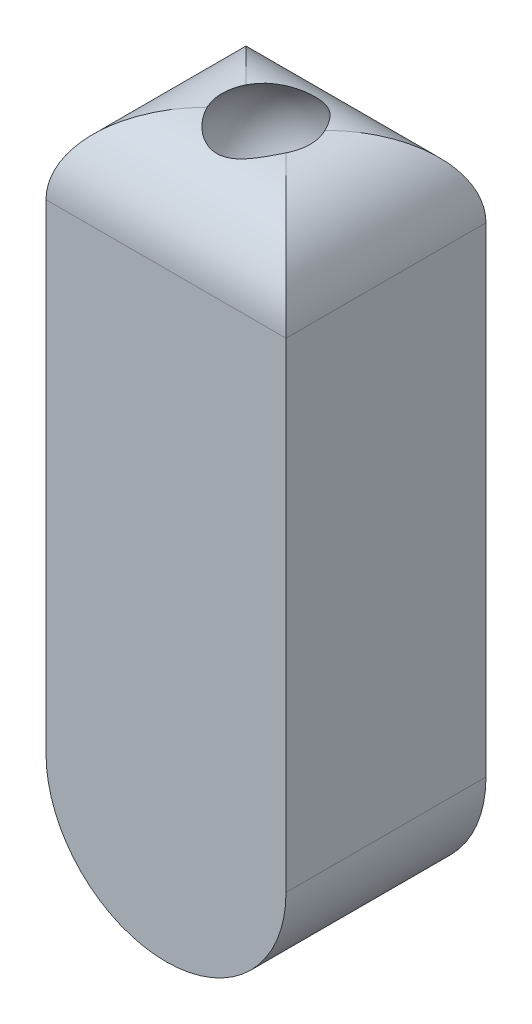
ISO-10303-21;
HEADER;
FILE_DESCRIPTION(('STEP AP214'),'2;1');
FILE_NAME('part.step','',(''),(''),'','','');
FILE_SCHEMA(('AUTOMOTIVE_DESIGN { 1 0 10303 214 1 1 1 1 }'));
ENDSEC;
DATA;
#1=APPLICATION_CONTEXT('core data for automotive mechanical design processes');
#2=APPLICATION_PROTOCOL_DEFINITION('international standard','automotive_design',2000,#1);
#3=PRODUCT_CONTEXT('',#1,'mechanical');
#4=PRODUCT('Part','Part','',(#3));
#5=PRODUCT_RELATED_PRODUCT_CATEGORY('part','',(#4));
#6=PRODUCT_DEFINITION_FORMATION('','',#4);
#7=PRODUCT_DEFINITION_CONTEXT('part definition',#1,'design');
#8=PRODUCT_DEFINITION('design','',#6,#7);
#9=PRODUCT_DEFINITION_SHAPE('','',#8);
#10=(LENGTH_UNIT() NAMED_UNIT(*) SI_UNIT(.MILLI.,.METRE.));
#11=(NAMED_UNIT(*) PLANE_ANGLE_UNIT() SI_UNIT($,.RADIAN.));
#12=(NAMED_UNIT(*) SI_UNIT($,.STERADIAN.) SOLID_ANGLE_UNIT());
#13=UNCERTAINTY_MEASURE_WITH_UNIT(LENGTH_MEASURE(1.E-05),#10,'distance_accuracy_value','');
#14=(GEOMETRIC_REPRESENTATION_CONTEXT(3) GLOBAL_UNCERTAINTY_ASSIGNED_CONTEXT((#13)) GLOBAL_UNIT_ASSIGNED_CONTEXT((#10,
#11,#12)) REPRESENTATION_CONTEXT('',''));
#15=CARTESIAN_POINT('',(0.,0.,0.));
#16=DIRECTION('',(0.,0.,1.));
#17=DIRECTION('',(1.,0.,0.));
#18=AXIS2_PLACEMENT_3D('',#15,#16,#17);
#19=CARTESIAN_POINT('',(-38.1,88.9,63.5));
#20=DIRECTION('',(0.,-1.,0.));
#21=DIRECTION('',(0.,0.,-1.));
#22=AXIS2_PLACEMENT_3D('',#19,#20,#21);
#23=PLANE('',#22);
#24=CARTESIAN_POINT('',(0.,88.9,31.75));
#25=DIRECTION('',(0.,-1.,0.));
#26=DIRECTION('',(0.,0.,-1.));
#27=AXIS2_PLACEMENT_3D('',#24,#25,#26);
#28=CIRCLE('',#27,13.97);
#29=CARTESIAN_POINT('',(-12.4434078933385,88.9,25.4));
#30=VERTEX_POINT('',#29);
#31=CARTESIAN_POINT('',(-12.7,88.9,25.9301288674061));
#32=VERTEX_POINT('',#31);
#33=EDGE_CURVE('E140',#30,#32,#28,.F.);
#34=ORIENTED_EDGE('',*,*,#33,.F.);
#35=DIRECTION('',(-1.,0.,0.));
#36=VECTOR('',#35,1.);
#37=CARTESIAN_POINT('',(-38.1,88.9,25.4));
#38=LINE('',#37,#36);
#39=CARTESIAN_POINT('',(-12.7,88.9,25.4));
#40=VERTEX_POINT('',#39);
#41=EDGE_CURVE('E199',#30,#40,#38,.T.);
#42=ORIENTED_EDGE('',*,*,#41,.T.);
#43=DIRECTION('',(0.,0.,-1.));
#44=VECTOR('',#43,1.);
#45=CARTESIAN_POINT('',(-12.7,88.9,63.5));
#46=LINE('',#45,#44);
#47=EDGE_CURVE('E141',#40,#32,#46,.F.);
#48=ORIENTED_EDGE('',*,*,#47,.T.);
#49=EDGE_LOOP('',(#34,#42,#48));
#50=FACE_BOUND('',#49,.T.);
#51=ADVANCED_FACE('F39',(#50),#23,.F.);
#52=CARTESIAN_POINT('',(-12.7,88.9,37.5698711325939));
#53=VERTEX_POINT('',#52);
#54=CARTESIAN_POINT('',(-12.4434078933369,88.9,38.1));
#55=VERTEX_POINT('',#54);
#56=EDGE_CURVE('E63',#53,#55,#28,.F.);
#57=ORIENTED_EDGE('',*,*,#56,.F.);
#58=CARTESIAN_POINT('',(-12.7,88.9,38.1));
#59=VERTEX_POINT('',#58);
#60=EDGE_CURVE('E150',#53,#59,#46,.F.);
#61=ORIENTED_EDGE('',*,*,#60,.T.);
#62=DIRECTION('',(-1.,0.,0.));
#63=VECTOR('',#62,1.);
#64=CARTESIAN_POINT('',(38.1,88.9,38.1));
#65=LINE('',#64,#63);
#66=EDGE_CURVE('E142',#59,#55,#65,.F.);
#67=ORIENTED_EDGE('',*,*,#66,.T.);
#68=EDGE_LOOP('',(#57,#61,#67));
#69=FACE_BOUND('',#68,.T.);
#70=ADVANCED_FACE('F272',(#69),#23,.F.);
#71=CARTESIAN_POINT('',(12.4434078933386,88.9,38.1));
#72=VERTEX_POINT('',#71);
#73=CARTESIAN_POINT('',(12.7,88.9,37.5698711325939));
#74=VERTEX_POINT('',#73);
#75=EDGE_CURVE('E121',#72,#74,#28,.F.);
#76=ORIENTED_EDGE('',*,*,#75,.F.);
#77=CARTESIAN_POINT('',(12.7,88.9,38.1));
#78=VERTEX_POINT('',#77);
#79=EDGE_CURVE('E134',#72,#78,#65,.F.);
#80=ORIENTED_EDGE('',*,*,#79,.T.);
#81=DIRECTION('',(0.,0.,-1.));
#82=VECTOR('',#81,1.);
#83=CARTESIAN_POINT('',(12.7,88.9,63.5));
#84=LINE('',#83,#82);
#85=EDGE_CURVE('E131',#78,#74,#84,.T.);
#86=ORIENTED_EDGE('',*,*,#85,.T.);
#87=EDGE_LOOP('',(#76,#80,#86));
#88=FACE_BOUND('',#87,.T.);
#89=ADVANCED_FACE('F133',(#88),#23,.F.);
#90=CARTESIAN_POINT('',(-38.1,63.5,25.4));
#91=DIRECTION('',(-1.,0.,0.));
#92=DIRECTION('',(0.,0.,1.));
#93=AXIS2_PLACEMENT_3D('',#90,#91,#92);
#94=CYLINDRICAL_SURFACE('',#93,25.4);
#95=ORIENTED_EDGE('',*,*,#41,.F.);
#96=CARTESIAN_POINT('',(-12.4435099543191,88.8999999992126,25.4002));
#97=CARTESIAN_POINT('',(-12.3323761394084,88.9000042449535,25.1824251378869));
#98=CARTESIAN_POINT('',(-12.2181755256439,88.8972019137025,24.9662394006213));
#99=CARTESIAN_POINT('',(-11.9835210184639,88.8862549511401,24.5374161790704));
#100=CARTESIAN_POINT('',(-11.8630668911387,88.8781101198622,24.3247788279045));
#101=CARTESIAN_POINT('',(-11.4920219513742,88.8460568058496,23.6925376958124));
#102=CARTESIAN_POINT('',(-11.231870188645,88.8145300895076,23.2788444702196));
#103=CARTESIAN_POINT('',(-10.6829315067911,88.7334616700738,22.4673902927873));
#104=CARTESIAN_POINT('',(-10.3939108203554,88.6837624790236,22.0698034422654));
#105=CARTESIAN_POINT('',(-9.78828505842701,88.5697033852126,21.2985635800477));
#106=CARTESIAN_POINT('',(-9.47168952404195,88.5053485410728,20.9249023669369));
#107=CARTESIAN_POINT('',(-8.86453774695291,88.3774638120554,20.2652775370036));
#108=CARTESIAN_POINT('',(-8.5783045187031,88.3155499174555,19.9750168269296));
#109=CARTESIAN_POINT('',(-7.98538168086478,88.186998174893,19.4171905574059));
#110=CARTESIAN_POINT('',(-7.6786909909998,88.1203600774524,19.1496261981569));
#111=CARTESIAN_POINT('',(-7.04572651488522,87.9857358932849,18.6414791832718));
#112=CARTESIAN_POINT('',(-6.71952458571322,87.9177553040537,18.4008058788415));
#113=CARTESIAN_POINT('',(-6.04677524519961,87.783754191526,17.9491777594111));
#114=CARTESIAN_POINT('',(-5.70023452347447,87.7177330343927,17.7382132496643));
#115=CARTESIAN_POINT('',(-5.07765079044909,87.6074512958687,17.3991183865022));
#116=CARTESIAN_POINT('',(-4.80589130757054,87.5619043296917,17.2635204621122));
#117=CARTESIAN_POINT('',(-4.25224896104928,87.4757529394808,17.0130572499707));
#118=CARTESIAN_POINT('',(-3.97036871946732,87.4351472470705,16.8981866380507));
#119=CARTESIAN_POINT('',(-3.39759967527705,87.3605309246433,16.6909694517745));
#120=CARTESIAN_POINT('',(-3.1067119558058,87.3265195052181,16.5986201810196));
#121=CARTESIAN_POINT('',(-2.51762878717357,87.2666255399975,16.4381440568044));
#122=CARTESIAN_POINT('',(-2.21943702312728,87.240738982459,16.3700052469513));
#123=CARTESIAN_POINT('',(-1.61551424701501,87.1981776248218,16.2588860466694));
#124=CARTESIAN_POINT('',(-1.30974465504036,87.1815697745577,16.2160883743126));
#125=CARTESIAN_POINT('',(-0.69523501454927,87.1587188586113,16.157379880083));
#126=CARTESIAN_POINT('',(-0.386494986934548,87.1524757200503,16.141468869159));
#127=CARTESIAN_POINT('',(0.231193115461653,87.1506902273434,16.136908865138));
#128=CARTESIAN_POINT('',(0.54014117269709,87.1551470620231,16.1482578054407));
#129=CARTESIAN_POINT('',(1.15550883645203,87.1745203594344,16.1979463292706));
#130=CARTESIAN_POINT('',(1.46192854776175,87.1894363864471,16.2362847884433));
#131=CARTESIAN_POINT('',(2.03924107288622,87.2269586480264,16.3339176068908));
#132=CARTESIAN_POINT('',(2.31061956563735,87.2486455369375,16.3907298683186));
#133=CARTESIAN_POINT('',(2.8477831856613,87.2989773181044,16.5245403082183));
#134=CARTESIAN_POINT('',(3.11356623136959,87.3276247517352,16.6015458603086));
#135=CARTESIAN_POINT('',(3.63802660082103,87.3907780332003,16.7745040803398));
#136=CARTESIAN_POINT('',(3.89670688520434,87.4252813956828,16.8704487130307));
#137=CARTESIAN_POINT('',(4.40614708155393,87.4989573825342,17.080001217652));
#138=CARTESIAN_POINT('',(4.65690520521922,87.5381310517571,17.1936130438729));
#139=CARTESIAN_POINT('',(5.25392095255965,87.637174329067,17.4886057709184));
#140=CARTESIAN_POINT('',(5.59578010904683,87.6987968130262,17.6783422948222));
#141=CARTESIAN_POINT('',(6.26090882874679,87.8254236376158,18.0870300192));
#142=CARTESIAN_POINT('',(6.58417161429493,87.8904291950114,18.3059917758228));
#143=CARTESIAN_POINT('',(7.21308784615848,88.0208066497886,18.770633673539));
#144=CARTESIAN_POINT('',(7.51865437064268,88.0861788670656,19.0164309789337));
#145=CARTESIAN_POINT('',(8.11061586038351,88.213992366933,19.5306870622638));
#146=CARTESIAN_POINT('',(8.39701123517445,88.2764337121242,19.7991453558379));
#147=CARTESIAN_POINT('',(9.05831568393889,88.4188505653076,20.4637421746673));
#148=CARTESIAN_POINT('',(9.42456582364446,88.4962552553609,20.869073832053));
#149=CARTESIAN_POINT('',(10.1223957760561,88.6343947412316,21.7115629908707));
#150=CARTESIAN_POINT('',(10.4539523285887,88.6951183970916,22.1487415150086));
#151=CARTESIAN_POINT('',(10.9243481533836,88.7697634810403,22.8213604227722));
#152=CARTESIAN_POINT('',(11.0759246828504,88.7918309411275,23.0471369159092));
#153=CARTESIAN_POINT('',(11.3710262125091,88.830205094454,23.5043965829794));
#154=CARTESIAN_POINT('',(11.5145510655745,88.8465116824549,23.7358798610802));
#155=CARTESIAN_POINT('',(11.7935004093556,88.8728882836279,24.2036189243471));
#156=CARTESIAN_POINT('',(11.9289348975325,88.8829661440994,24.4398683155934));
#157=CARTESIAN_POINT('',(12.1920228909456,88.8965265481862,24.9168292547207));
#158=CARTESIAN_POINT('',(12.3196768458115,88.9000094732671,25.1575405437024));
#159=CARTESIAN_POINT('',(12.4435099543192,88.8999999992127,25.4001999999999));
#160=B_SPLINE_CURVE_WITH_KNOTS('',3,(#96,#97,#98,#99,#100,#101,#102,#103,#104,#105,#106,#107,
#108,#109,#110,#111,#112,#113,#114,#115,#116,#117,#118,#119,#120,#121,#122,#123,#124,#125,#126,
#127,#128,#129,#130,#131,#132,#133,#134,#135,#136,#137,#138,#139,#140,#141,#142,#143,#144,#145,
#146,#147,#148,#149,#150,#151,#152,#153,#154,#155,#156,#157,#158,#159),.UNSPECIFIED.,.F.,.F.,(4,
2,2,2,2,2,2,2,2,2,2,2,2,2,2,2,2,2,2,2,2,2,2,2,2,2,2,2,2,2,2,4),(0.,0.733392977951157,
1.46681340791192,2.93445847423132,4.41513630411131,5.89530382812477,7.13124023551552,
8.36724195949599,9.5989427528822,10.8302406744648,11.7507529821406,12.6710285026762,
13.5911937878036,14.5109040134576,15.4371673583551,16.3634241902843,17.2896108041016,
18.215758836258,19.0491910239121,19.8829279657094,20.7163119367581,21.5498827059056,
22.7355304823032,23.9216076792931,25.1130877018125,26.3045422637953,27.9572738878498,
29.6111065735348,30.4294076988603,31.2477237719496,32.0650067718591,32.8822424968748),.UNSPECIFIED.);
#161=CARTESIAN_POINT('',(12.4434078933385,88.9,25.4));
#162=VERTEX_POINT('',#161);
#163=EDGE_CURVE('E156',#30,#162,#160,.T.);
#164=ORIENTED_EDGE('',*,*,#163,.T.);
#165=CARTESIAN_POINT('',(12.7,88.9,25.4));
#166=VERTEX_POINT('',#165);
#167=EDGE_CURVE('E203',#166,#162,#38,.T.);
#168=ORIENTED_EDGE('',*,*,#167,.F.);
#169=CARTESIAN_POINT('',(12.7,63.5,25.4));
#170=DIRECTION('',(-0.707106781186547,0.,-0.707106781186547));
#171=DIRECTION('',(0.707106781186547,0.,-0.707106781186547));
#172=AXIS2_PLACEMENT_3D('',#169,#170,#171);
#173=ELLIPSE('',#172,35.9210244842766,25.4);
#174=CARTESIAN_POINT('',(38.1,63.5,0.));
#175=VERTEX_POINT('',#174);
#176=EDGE_CURVE('E159',#175,#166,#173,.F.);
#177=ORIENTED_EDGE('',*,*,#176,.F.);
#178=DIRECTION('',(-1.,0.,0.));
#179=VECTOR('',#178,1.);
#180=CARTESIAN_POINT('',(0.,63.5,0.));
#181=LINE('',#180,#179);
#182=CARTESIAN_POINT('',(-38.1,63.5,0.));
#183=VERTEX_POINT('',#182);
#184=EDGE_CURVE('E66',#183,#175,#181,.F.);
#185=ORIENTED_EDGE('',*,*,#184,.F.);
#186=CARTESIAN_POINT('',(-12.7,63.5,25.4));
#187=DIRECTION('',(-0.707106781186547,0.,0.707106781186547));
#188=DIRECTION('',(-0.707106781186547,0.,-0.707106781186547));
#189=AXIS2_PLACEMENT_3D('',#186,#187,#188);
#190=ELLIPSE('',#189,35.9210244842766,25.4);
#191=EDGE_CURVE('E158',#40,#183,#190,.T.);
#192=ORIENTED_EDGE('',*,*,#191,.F.);
#193=EDGE_LOOP('',(#95,#164,#168,#177,#185,#192));
#194=FACE_BOUND('',#193,.T.);
#195=ADVANCED_FACE('F41',(#194),#94,.T.);
#196=CARTESIAN_POINT('',(12.7,63.5,63.5));
#197=DIRECTION('',(0.,0.,-1.));
#198=DIRECTION('',(-1.,0.,0.));
#199=AXIS2_PLACEMENT_3D('',#196,#197,#198);
#200=CYLINDRICAL_SURFACE('',#199,25.4);
#201=CARTESIAN_POINT('',(12.7,88.9,25.930128867406));
#202=VERTEX_POINT('',#201);
#203=EDGE_CURVE('E200',#202,#166,#84,.T.);
#204=ORIENTED_EDGE('',*,*,#203,.F.);
#205=CARTESIAN_POINT('',(12.6998,88.8999999992126,25.9296924494286));
#206=CARTESIAN_POINT('',(12.8633109394039,88.8999722694415,26.2862973326325));
#207=CARTESIAN_POINT('',(13.013232462508,88.8984204295879,26.6492593260507));
#208=CARTESIAN_POINT('',(13.283784276495,88.893659282895,27.3861785212475));
#209=CARTESIAN_POINT('',(13.4043955509052,88.8904489041957,27.7601426858032));
#210=CARTESIAN_POINT('',(13.6138370922187,88.8837701775928,28.5163027772611));
#211=CARTESIAN_POINT('',(13.7027156156466,88.8803022311634,28.8984852598445));
#212=CARTESIAN_POINT('',(13.8472100818346,88.8741834766966,29.6690133232489));
#213=CARTESIAN_POINT('',(13.9028346890403,88.8715324558932,30.0573572715801));
#214=CARTESIAN_POINT('',(13.9798629804661,88.8677640744831,30.8391707328676));
#215=CARTESIAN_POINT('',(14.001115569141,88.8666534884812,31.2326552526361));
#216=CARTESIAN_POINT('',(14.0084676042009,88.8662754204029,32.0200112028377));
#217=CARTESIAN_POINT('',(13.9945618292534,88.8670082120845,32.4138826820546));
#218=CARTESIAN_POINT('',(13.9319117930881,88.8701274092166,33.1985195116685));
#219=CARTESIAN_POINT('',(13.883194914104,88.8725125149204,33.5892870594794));
#220=CARTESIAN_POINT('',(13.7520172536461,88.8782887266134,34.3649411126915));
#221=CARTESIAN_POINT('',(13.6695663403722,88.8816795383243,34.7498293038507));
#222=CARTESIAN_POINT('',(13.4626468265231,88.888779744354,35.54950093231));
#223=CARTESIAN_POINT('',(13.3347954916458,88.8924870114904,35.9634148901514));
#224=CARTESIAN_POINT('',(13.1161401618788,88.8966944518203,36.5741097399749));
#225=CARTESIAN_POINT('',(13.0388396821803,88.8978709992306,36.7758391510879));
#226=CARTESIAN_POINT('',(12.8756604024558,88.899523517354,37.1757667226575));
#227=CARTESIAN_POINT('',(12.789782925573,88.8999995959484,37.3739654222428));
#228=CARTESIAN_POINT('',(12.6998,88.8999999992126,37.5703075505714));
#229=B_SPLINE_CURVE_WITH_KNOTS('',3,(#205,#206,#207,#208,#209,#210,#211,#212,#213,#214,#215,
#216,#217,#218,#219,#220,#221,#222,#223,#224,#225,#226,#227,#228),.UNSPECIFIED.,.F.,.F.,(4,2,2,
2,2,2,2,2,2,2,2,4),(0.,1.1767998607244,2.35436120223384,3.53012410172385,4.70558051765664,
5.8861902003584,7.066975224489,8.24683247023635,9.42634481943627,10.7240615407519,
11.3720011443585,12.0198409465534),.UNSPECIFIED.);
#230=EDGE_CURVE('E219',#202,#74,#229,.T.);
#231=ORIENTED_EDGE('',*,*,#230,.T.);
#232=ORIENTED_EDGE('',*,*,#85,.F.);
#233=CARTESIAN_POINT('',(12.7,63.5,38.1));
#234=DIRECTION('',(0.707106781186547,0.,-0.707106781186547));
#235=DIRECTION('',(-0.707106781186547,0.,-0.707106781186547));
#236=AXIS2_PLACEMENT_3D('',#233,#234,#235);
#237=ELLIPSE('',#236,35.9210244842766,25.4);
#238=CARTESIAN_POINT('',(38.1,63.5,63.5));
#239=VERTEX_POINT('',#238);
#240=EDGE_CURVE('E143',#239,#78,#237,.F.);
#241=ORIENTED_EDGE('',*,*,#240,.F.);
#242=DIRECTION('',(0.,0.,-1.));
#243=VECTOR('',#242,1.);
#244=CARTESIAN_POINT('',(38.1,63.5,63.5));
#245=LINE('',#244,#243);
#246=EDGE_CURVE('E53',#175,#239,#245,.F.);
#247=ORIENTED_EDGE('',*,*,#246,.F.);
#248=ORIENTED_EDGE('',*,*,#176,.T.);
#249=EDGE_LOOP('',(#204,#231,#232,#241,#247,#248));
#250=FACE_BOUND('',#249,.T.);
#251=ADVANCED_FACE('F250',(#250),#200,.T.);
#252=CARTESIAN_POINT('',(-12.7,63.5,63.5));
#253=DIRECTION('',(0.,0.,-1.));
#254=DIRECTION('',(-1.,0.,0.));
#255=AXIS2_PLACEMENT_3D('',#252,#253,#254);
#256=CYLINDRICAL_SURFACE('',#255,25.4);
#257=ORIENTED_EDGE('',*,*,#60,.F.);
#258=CARTESIAN_POINT('',(-12.6998,88.8999999992126,37.5703075505713));
#259=CARTESIAN_POINT('',(-12.8633109394039,88.8999722694415,37.2137026673674));
#260=CARTESIAN_POINT('',(-13.013232462508,88.8984204295879,36.8507406739492));
#261=CARTESIAN_POINT('',(-13.283784276495,88.893659282895,36.1138214787524));
#262=CARTESIAN_POINT('',(-13.4043955509053,88.8904489041957,35.7398573141968));
#263=CARTESIAN_POINT('',(-13.6138370922188,88.8837701775928,34.9836972227388));
#264=CARTESIAN_POINT('',(-13.7027156156466,88.8803022311634,34.6015147401555));
#265=CARTESIAN_POINT('',(-13.8472100818346,88.8741834766966,33.830986676751));
#266=CARTESIAN_POINT('',(-13.9028346890403,88.8715324558932,33.4426427284198));
#267=CARTESIAN_POINT('',(-13.9798629804661,88.8677640744831,32.6608292671323));
#268=CARTESIAN_POINT('',(-14.001115569141,88.8666534884812,32.2673447473638));
#269=CARTESIAN_POINT('',(-14.0084676042009,88.8662754204029,31.4799887971622));
#270=CARTESIAN_POINT('',(-13.9945618292534,88.8670082120845,31.0861173179453));
#271=CARTESIAN_POINT('',(-13.9319117930881,88.8701274092166,30.3014804883314));
#272=CARTESIAN_POINT('',(-13.883194914104,88.8725125149204,29.9107129405205));
#273=CARTESIAN_POINT('',(-13.7520172536461,88.8782887266134,29.1350588873085));
#274=CARTESIAN_POINT('',(-13.6695663403722,88.8816795383243,28.7501706961492));
#275=CARTESIAN_POINT('',(-13.462646826523,88.888779744354,27.9504990676899));
#276=CARTESIAN_POINT('',(-13.3347954916458,88.8924870114904,27.5365851098486));
#277=CARTESIAN_POINT('',(-13.1161401618788,88.8966944518203,26.9258902600251));
#278=CARTESIAN_POINT('',(-13.0388396821803,88.8978709992306,26.7241608489121));
#279=CARTESIAN_POINT('',(-12.8756604024559,88.899523517354,26.3242332773425));
#280=CARTESIAN_POINT('',(-12.789782925573,88.8999995959484,26.1260345777573));
#281=CARTESIAN_POINT('',(-12.6998,88.8999999992126,25.9296924494287));
#282=B_SPLINE_CURVE_WITH_KNOTS('',3,(#258,#259,#260,#261,#262,#263,#264,#265,#266,#267,#268,
#269,#270,#271,#272,#273,#274,#275,#276,#277,#278,#279,#280,#281),.UNSPECIFIED.,.F.,.F.,(4,2,2,
2,2,2,2,2,2,2,2,4),(0.,1.1767998607244,2.35436120223384,3.53012410172386,4.70558051765665,
5.88619020035841,7.06697522448901,8.24683247023636,9.42634481943628,10.7240615407518,
11.3720011443584,12.0198409465533),.UNSPECIFIED.);
#283=EDGE_CURVE('E217',#53,#32,#282,.T.);
#284=ORIENTED_EDGE('',*,*,#283,.T.);
#285=ORIENTED_EDGE('',*,*,#47,.F.);
#286=ORIENTED_EDGE('',*,*,#191,.T.);
#287=DIRECTION('',(0.,0.,-1.));
#288=VECTOR('',#287,1.);
#289=CARTESIAN_POINT('',(-38.1,63.5,63.5));
#290=LINE('',#289,#288);
#291=CARTESIAN_POINT('',(-38.1,63.5,63.5));
#292=VERTEX_POINT('',#291);
#293=EDGE_CURVE('E144',#292,#183,#290,.T.);
#294=ORIENTED_EDGE('',*,*,#293,.F.);
#295=CARTESIAN_POINT('',(-12.7,63.5,38.1));
#296=DIRECTION('',(-0.707106781186547,0.,-0.707106781186547));
#297=DIRECTION('',(0.707106781186547,0.,-0.707106781186547));
#298=AXIS2_PLACEMENT_3D('',#295,#296,#297);
#299=ELLIPSE('',#298,35.9210244842766,25.4);
#300=EDGE_CURVE('E152',#59,#292,#299,.F.);
#301=ORIENTED_EDGE('',*,*,#300,.F.);
#302=EDGE_LOOP('',(#257,#284,#285,#286,#294,#301));
#303=FACE_BOUND('',#302,.T.);
#304=ADVANCED_FACE('F220',(#303),#256,.T.);
#305=CARTESIAN_POINT('',(0.,63.5,38.1));
#306=DIRECTION('',(1.,0.,0.));
#307=DIRECTION('',(0.,0.,-1.));
#308=AXIS2_PLACEMENT_3D('',#305,#306,#307);
#309=CYLINDRICAL_SURFACE('',#308,25.4);
#310=ORIENTED_EDGE('',*,*,#79,.F.);
#311=CARTESIAN_POINT('',(12.4435099543191,88.8999999992126,38.0998));
#312=CARTESIAN_POINT('',(12.3323761394084,88.9000042449535,38.3175748621131));
#313=CARTESIAN_POINT('',(12.2181755256439,88.8972019137025,38.5337605993787));
#314=CARTESIAN_POINT('',(11.9835210184639,88.8862549511401,38.9625838209296));
#315=CARTESIAN_POINT('',(11.8630668911387,88.8781101198622,39.1752211720955));
#316=CARTESIAN_POINT('',(11.4920219513742,88.8460568058496,39.8074623041876));
#317=CARTESIAN_POINT('',(11.231870188645,88.8145300895076,40.2211555297804));
#318=CARTESIAN_POINT('',(10.6829315067911,88.7334616700738,41.0326097072127));
#319=CARTESIAN_POINT('',(10.3939108203554,88.6837624790236,41.4301965577346));
#320=CARTESIAN_POINT('',(9.78828505842701,88.5697033852126,42.2014364199523));
#321=CARTESIAN_POINT('',(9.47168952404195,88.5053485410728,42.5750976330631));
#322=CARTESIAN_POINT('',(8.86453774695291,88.3774638120554,43.2347224629964));
#323=CARTESIAN_POINT('',(8.57830451870309,88.3155499174555,43.5249831730704));
#324=CARTESIAN_POINT('',(7.98538168086477,88.186998174893,44.0828094425941));
#325=CARTESIAN_POINT('',(7.67869099099979,88.1203600774524,44.3503738018431));
#326=CARTESIAN_POINT('',(7.04572651488522,87.9857358932848,44.8585208167282));
#327=CARTESIAN_POINT('',(6.71952458571321,87.9177553040537,45.0991941211585));
#328=CARTESIAN_POINT('',(6.0467752451996,87.783754191526,45.5508222405889));
#329=CARTESIAN_POINT('',(5.70023452347446,87.7177330343928,45.7617867503357));
#330=CARTESIAN_POINT('',(5.07765079044909,87.6074512958687,46.1008816134978));
#331=CARTESIAN_POINT('',(4.80589130757054,87.5619043296916,46.2364795378878));
#332=CARTESIAN_POINT('',(4.25224896104929,87.4757529394807,46.4869427500293));
#333=CARTESIAN_POINT('',(3.97036871946733,87.4351472470705,46.6018133619493));
#334=CARTESIAN_POINT('',(3.39759967527706,87.3605309246433,46.8090305482255));
#335=CARTESIAN_POINT('',(3.1067119558058,87.3265195052181,46.9013798189804));
#336=CARTESIAN_POINT('',(2.51762878717357,87.2666255399975,47.0618559431956));
#337=CARTESIAN_POINT('',(2.21943702312728,87.240738982459,47.1299947530487));
#338=CARTESIAN_POINT('',(1.61551424701501,87.1981776248218,47.2411139533306));
#339=CARTESIAN_POINT('',(1.30974465504036,87.1815697745577,47.2839116256874));
#340=CARTESIAN_POINT('',(0.695235014549272,87.1587188586113,47.342620119917));
#341=CARTESIAN_POINT('',(0.386494986934552,87.1524757200503,47.358531130841));
#342=CARTESIAN_POINT('',(-0.231193115461649,87.1506902273434,47.363091134862));
#343=CARTESIAN_POINT('',(-0.540141172697086,87.1551470620231,47.3517421945593));
#344=CARTESIAN_POINT('',(-1.15550883645203,87.1745203594344,47.3020536707294));
#345=CARTESIAN_POINT('',(-1.46192854776174,87.1894363864471,47.2637152115567));
#346=CARTESIAN_POINT('',(-2.03924107288622,87.2269586480264,47.1660823931092));
#347=CARTESIAN_POINT('',(-2.31061956563734,87.2486455369375,47.1092701316814));
#348=CARTESIAN_POINT('',(-2.84778318566129,87.2989773181044,46.9754596917817));
#349=CARTESIAN_POINT('',(-3.11356623136958,87.3276247517352,46.8984541396914));
#350=CARTESIAN_POINT('',(-3.63802660082103,87.3907780332003,46.7254959196602));
#351=CARTESIAN_POINT('',(-3.89670688520434,87.4252813956828,46.6295512869693));
#352=CARTESIAN_POINT('',(-4.40614708155392,87.4989573825342,46.419998782348));
#353=CARTESIAN_POINT('',(-4.65690520521921,87.5381310517571,46.3063869561271));
#354=CARTESIAN_POINT('',(-5.25392095255964,87.637174329067,46.0113942290816));
#355=CARTESIAN_POINT('',(-5.59578010904683,87.6987968130262,45.8216577051778));
#356=CARTESIAN_POINT('',(-6.26090882874678,87.8254236376158,45.4129699808));
#357=CARTESIAN_POINT('',(-6.58417161429492,87.8904291950114,45.1940082241772));
#358=CARTESIAN_POINT('',(-7.21308784615848,88.0208066497886,44.729366326461));
#359=CARTESIAN_POINT('',(-7.51865437064268,88.0861788670656,44.4835690210663));
#360=CARTESIAN_POINT('',(-8.11061586038351,88.213992366933,43.9693129377362));
#361=CARTESIAN_POINT('',(-8.39701123517445,88.2764337121242,43.7008546441621));
#362=CARTESIAN_POINT('',(-9.05831568393888,88.4188505653076,43.0362578253326));
#363=CARTESIAN_POINT('',(-9.42456582364445,88.4962552553609,42.630926167947));
#364=CARTESIAN_POINT('',(-10.1223957760561,88.6343947412316,41.7884370091293));
#365=CARTESIAN_POINT('',(-10.4539523285887,88.6951183970916,41.3512584849914));
#366=CARTESIAN_POINT('',(-10.9243481533836,88.7697634810403,40.6786395772278));
#367=CARTESIAN_POINT('',(-11.0759246828504,88.7918309411275,40.4528630840908));
#368=CARTESIAN_POINT('',(-11.3710262125091,88.830205094454,39.9956034170206));
#369=CARTESIAN_POINT('',(-11.5145510655745,88.8465116824549,39.7641201389198));
#370=CARTESIAN_POINT('',(-11.7935004093556,88.8728882836279,39.2963810756529));
#371=CARTESIAN_POINT('',(-11.9289348975325,88.8829661440994,39.0601316844066));
#372=CARTESIAN_POINT('',(-12.1920228909456,88.8965265481862,38.5831707452793));
#373=CARTESIAN_POINT('',(-12.3196768458115,88.9000094732671,38.3424594562976));
#374=CARTESIAN_POINT('',(-12.4435099543192,88.8999999992127,38.0998000000001));
#375=B_SPLINE_CURVE_WITH_KNOTS('',3,(#311,#312,#313,#314,#315,#316,#317,#318,#319,#320,#321,
#322,#323,#324,#325,#326,#327,#328,#329,#330,#331,#332,#333,#334,#335,#336,#337,#338,#339,#340,
#341,#342,#343,#344,#345,#346,#347,#348,#349,#350,#351,#352,#353,#354,#355,#356,#357,#358,#359,
#360,#361,#362,#363,#364,#365,#366,#367,#368,#369,#370,#371,#372,#373,#374),.UNSPECIFIED.,.F.,
.F.,(4,2,2,2,2,2,2,2,2,2,2,2,2,2,2,2,2,2,2,2,2,2,2,2,2,2,2,2,2,2,2,4),(0.,0.733392977951154,
1.46681340791191,2.93445847423132,4.4151363041113,5.89530382812477,7.13124023551553,
8.367241959496,9.59894275288221,10.8302406744648,11.7507529821406,12.6710285026762,
13.5911937878036,14.5109040134576,15.4371673583551,16.3634241902843,17.2896108041016,
18.215758836258,19.0491910239121,19.8829279657094,20.7163119367581,21.5498827059056,
22.7355304823032,23.9216076792931,25.1130877018125,26.3045422637953,27.9572738878498,
29.6111065735348,30.4294076988603,31.2477237719496,32.0650067718591,32.8822424968748),.UNSPECIFIED.);
#376=EDGE_CURVE('E11',#72,#55,#375,.T.);
#377=ORIENTED_EDGE('',*,*,#376,.T.);
#378=ORIENTED_EDGE('',*,*,#66,.F.);
#379=ORIENTED_EDGE('',*,*,#300,.T.);
#380=DIRECTION('',(-1.,0.,0.));
#381=VECTOR('',#380,1.);
#382=CARTESIAN_POINT('',(-38.1,63.5,63.5));
#383=LINE('',#382,#381);
#384=EDGE_CURVE('E198',#239,#292,#383,.T.);
#385=ORIENTED_EDGE('',*,*,#384,.F.);
#386=ORIENTED_EDGE('',*,*,#240,.T.);
#387=EDGE_LOOP('',(#310,#377,#378,#379,#385,#386));
#388=FACE_BOUND('',#387,.T.);
#389=ADVANCED_FACE('F136',(#388),#309,.T.);
#390=CARTESIAN_POINT('',(38.1,88.9,63.5));
#391=DIRECTION('',(-1.,0.,0.));
#392=DIRECTION('',(0.,-1.,0.));
#393=AXIS2_PLACEMENT_3D('',#390,#391,#392);
#394=PLANE('',#393);
#395=DIRECTION('',(0.,1.,0.));
#396=VECTOR('',#395,1.);
#397=CARTESIAN_POINT('',(38.1,88.9,0.));
#398=LINE('',#397,#396);
#399=CARTESIAN_POINT('',(38.1,-88.9,0.));
#400=VERTEX_POINT('',#399);
#401=EDGE_CURVE('E177',#400,#175,#398,.T.);
#402=ORIENTED_EDGE('',*,*,#401,.T.);
#403=ORIENTED_EDGE('',*,*,#246,.T.);
#404=DIRECTION('',(0.,1.,0.));
#405=VECTOR('',#404,1.);
#406=CARTESIAN_POINT('',(38.1,88.9,63.5));
#407=LINE('',#406,#405);
#408=CARTESIAN_POINT('',(38.1,-88.9,63.5));
#409=VERTEX_POINT('',#408);
#410=EDGE_CURVE('E181',#409,#239,#407,.T.);
#411=ORIENTED_EDGE('',*,*,#410,.F.);
#412=DIRECTION('',(0.,0.,-1.));
#413=VECTOR('',#412,1.);
#414=CARTESIAN_POINT('',(38.1,-88.9,63.5));
#415=LINE('',#414,#413);
#416=EDGE_CURVE('E190',#409,#400,#415,.T.);
#417=ORIENTED_EDGE('',*,*,#416,.T.);
#418=EDGE_LOOP('',(#402,#403,#411,#417));
#419=FACE_BOUND('',#418,.T.);
#420=ADVANCED_FACE('F257',(#419),#394,.F.);
#421=EDGE_CURVE('E225',#202,#162,#28,.F.);
#422=ORIENTED_EDGE('',*,*,#421,.F.);
#423=ORIENTED_EDGE('',*,*,#203,.T.);
#424=ORIENTED_EDGE('',*,*,#167,.T.);
#425=EDGE_LOOP('',(#422,#423,#424));
#426=FACE_BOUND('',#425,.T.);
#427=ADVANCED_FACE('F248',(#426),#23,.F.);
#428=CARTESIAN_POINT('',(-38.1,88.9,63.5));
#429=DIRECTION('',(1.,0.,0.));
#430=DIRECTION('',(0.,1.,0.));
#431=AXIS2_PLACEMENT_3D('',#428,#429,#430);
#432=PLANE('',#431);
#433=DIRECTION('',(0.,-1.,0.));
#434=VECTOR('',#433,1.);
#435=CARTESIAN_POINT('',(-38.1,88.9,63.5));
#436=LINE('',#435,#434);
#437=CARTESIAN_POINT('',(-38.1,-88.9,63.5));
#438=VERTEX_POINT('',#437);
#439=EDGE_CURVE('E188',#292,#438,#436,.T.);
#440=ORIENTED_EDGE('',*,*,#439,.F.);
#441=ORIENTED_EDGE('',*,*,#293,.T.);
#442=DIRECTION('',(0.,-1.,0.));
#443=VECTOR('',#442,1.);
#444=CARTESIAN_POINT('',(-38.1,88.9,0.));
#445=LINE('',#444,#443);
#446=CARTESIAN_POINT('',(-38.1,-88.9,0.));
#447=VERTEX_POINT('',#446);
#448=EDGE_CURVE('E189',#183,#447,#445,.T.);
#449=ORIENTED_EDGE('',*,*,#448,.T.);
#450=DIRECTION('',(0.,0.,-1.));
#451=VECTOR('',#450,1.);
#452=CARTESIAN_POINT('',(-38.1,-88.9,63.5));
#453=LINE('',#452,#451);
#454=EDGE_CURVE('E191',#438,#447,#453,.T.);
#455=ORIENTED_EDGE('',*,*,#454,.F.);
#456=EDGE_LOOP('',(#440,#441,#449,#455));
#457=FACE_BOUND('',#456,.T.);
#458=ADVANCED_FACE('F251',(#457),#432,.F.);
#459=CARTESIAN_POINT('',(0.,0.,63.5));
#460=DIRECTION('',(0.,0.,1.));
#461=DIRECTION('',(1.,0.,0.));
#462=AXIS2_PLACEMENT_3D('',#459,#460,#461);
#463=PLANE('',#462);
#464=ORIENTED_EDGE('',*,*,#410,.T.);
#465=ORIENTED_EDGE('',*,*,#384,.T.);
#466=ORIENTED_EDGE('',*,*,#439,.T.);
#467=CARTESIAN_POINT('',(0.,-88.9,63.5));
#468=DIRECTION('',(0.,0.,1.));
#469=DIRECTION('',(1.,0.,0.));
#470=AXIS2_PLACEMENT_3D('',#467,#468,#469);
#471=CIRCLE('',#470,38.1);
#472=EDGE_CURVE('E180',#438,#409,#471,.T.);
#473=ORIENTED_EDGE('',*,*,#472,.T.);
#474=EDGE_LOOP('',(#464,#465,#466,#473));
#475=FACE_BOUND('',#474,.T.);
#476=ADVANCED_FACE('F247',(#475),#463,.T.);
#477=CARTESIAN_POINT('',(0.,0.,0.));
#478=DIRECTION('',(0.,0.,1.));
#479=DIRECTION('',(1.,0.,0.));
#480=AXIS2_PLACEMENT_3D('',#477,#478,#479);
#481=PLANE('',#480);
#482=CARTESIAN_POINT('',(0.,-88.9,0.));
#483=DIRECTION('',(0.,0.,1.));
#484=DIRECTION('',(1.,0.,0.));
#485=AXIS2_PLACEMENT_3D('',#482,#483,#484);
#486=CIRCLE('',#485,13.97);
#487=CARTESIAN_POINT('',(-13.97,-88.9,0.));
#488=VERTEX_POINT('',#487);
#489=EDGE_CURVE('E165',#488,#488,#486,.T.);
#490=ORIENTED_EDGE('',*,*,#489,.T.);
#491=EDGE_LOOP('',(#490));
#492=FACE_BOUND('',#491,.T.);
#493=ORIENTED_EDGE('',*,*,#448,.F.);
#494=ORIENTED_EDGE('',*,*,#184,.T.);
#495=ORIENTED_EDGE('',*,*,#401,.F.);
#496=CARTESIAN_POINT('',(0.,-88.9,0.));
#497=DIRECTION('',(0.,0.,1.));
#498=DIRECTION('',(1.,0.,0.));
#499=AXIS2_PLACEMENT_3D('',#496,#497,#498);
#500=CIRCLE('',#499,38.1);
#501=EDGE_CURVE('E172',#447,#400,#500,.T.);
#502=ORIENTED_EDGE('',*,*,#501,.F.);
#503=EDGE_LOOP('',(#493,#494,#495,#502));
#504=FACE_BOUND('',#503,.T.);
#505=ADVANCED_FACE('F261',(#492,#504),#481,.F.);
#506=CARTESIAN_POINT('',(0.,-88.9,63.5));
#507=DIRECTION('',(0.,0.,-1.));
#508=DIRECTION('',(-1.,0.,0.));
#509=AXIS2_PLACEMENT_3D('',#506,#507,#508);
#510=CYLINDRICAL_SURFACE('',#509,38.1);
#511=ORIENTED_EDGE('',*,*,#501,.T.);
#512=ORIENTED_EDGE('',*,*,#416,.F.);
#513=ORIENTED_EDGE('',*,*,#472,.F.);
#514=ORIENTED_EDGE('',*,*,#454,.T.);
#515=EDGE_LOOP('',(#511,#512,#513,#514));
#516=FACE_BOUND('',#515,.T.);
#517=ADVANCED_FACE('F256',(#516),#510,.T.);
#518=CARTESIAN_POINT('',(0.,-88.9,48.26));
#519=DIRECTION('',(0.,0.,-1.));
#520=DIRECTION('',(-1.,0.,0.));
#521=AXIS2_PLACEMENT_3D('',#518,#519,#520);
#522=CYLINDRICAL_SURFACE('',#521,13.97);
#523=CARTESIAN_POINT('',(0.,-88.9,48.26));
#524=DIRECTION('',(0.,0.,1.));
#525=DIRECTION('',(1.,0.,0.));
#526=AXIS2_PLACEMENT_3D('',#523,#524,#525);
#527=CIRCLE('',#526,13.97);
#528=CARTESIAN_POINT('',(-13.97,-88.9,48.26));
#529=VERTEX_POINT('',#528);
#530=EDGE_CURVE('E169',#529,#529,#527,.T.);
#531=CARTESIAN_POINT('',(-13.97,-88.9,48.26));
#532=CARTESIAN_POINT('',(-13.97,-88.9,47.7572916666667));
#533=CARTESIAN_POINT('',(-13.97,-88.9,47.2545833333333));
#534=CARTESIAN_POINT('',(-13.97,-88.9,46.2491666666667));
#535=CARTESIAN_POINT('',(-13.97,-88.9,45.7464583333333));
#536=CARTESIAN_POINT('',(-13.97,-88.9,44.7410416666667));
#537=CARTESIAN_POINT('',(-13.97,-88.9,44.2383333333333));
#538=CARTESIAN_POINT('',(-13.97,-88.9,43.2329166666667));
#539=CARTESIAN_POINT('',(-13.97,-88.9,42.7302083333333));
#540=CARTESIAN_POINT('',(-13.97,-88.9,41.7247916666667));
#541=CARTESIAN_POINT('',(-13.97,-88.9,41.2220833333333));
#542=CARTESIAN_POINT('',(-13.97,-88.9,40.2166666666667));
#543=CARTESIAN_POINT('',(-13.97,-88.9,39.7139583333333));
#544=CARTESIAN_POINT('',(-13.97,-88.9,38.7085416666667));
#545=CARTESIAN_POINT('',(-13.97,-88.9,38.2058333333333));
#546=CARTESIAN_POINT('',(-13.97,-88.9,37.2004166666667));
#547=CARTESIAN_POINT('',(-13.97,-88.9,36.6977083333333));
#548=CARTESIAN_POINT('',(-13.97,-88.9,35.6922916666667));
#549=CARTESIAN_POINT('',(-13.97,-88.9,35.1895833333333));
#550=CARTESIAN_POINT('',(-13.97,-88.9,34.1841666666667));
#551=CARTESIAN_POINT('',(-13.97,-88.9,33.6814583333333));
#552=CARTESIAN_POINT('',(-13.97,-88.9,32.6760416666667));
#553=CARTESIAN_POINT('',(-13.97,-88.9,32.1733333333333));
#554=CARTESIAN_POINT('',(-13.97,-88.9,31.1679166666667));
#555=CARTESIAN_POINT('',(-13.97,-88.9,30.6652083333333));
#556=CARTESIAN_POINT('',(-13.97,-88.9,29.6597916666667));
#557=CARTESIAN_POINT('',(-13.97,-88.9,29.1570833333333));
#558=CARTESIAN_POINT('',(-13.97,-88.9,28.1516666666667));
#559=CARTESIAN_POINT('',(-13.97,-88.9,27.6489583333333));
#560=CARTESIAN_POINT('',(-13.97,-88.9,26.6435416666667));
#561=CARTESIAN_POINT('',(-13.97,-88.9,26.1408333333333));
#562=CARTESIAN_POINT('',(-13.97,-88.9,25.1354166666667));
#563=CARTESIAN_POINT('',(-13.97,-88.9,24.6327083333333));
#564=CARTESIAN_POINT('',(-13.97,-88.9,23.6272916666667));
#565=CARTESIAN_POINT('',(-13.97,-88.9,23.1245833333333));
#566=CARTESIAN_POINT('',(-13.97,-88.9,22.1191666666667));
#567=CARTESIAN_POINT('',(-13.97,-88.9,21.6164583333333));
#568=CARTESIAN_POINT('',(-13.97,-88.9,20.6110416666667));
#569=CARTESIAN_POINT('',(-13.97,-88.9,20.1083333333333));
#570=CARTESIAN_POINT('',(-13.97,-88.9,19.1029166666667));
#571=CARTESIAN_POINT('',(-13.97,-88.9,18.6002083333333));
#572=CARTESIAN_POINT('',(-13.97,-88.9,17.5947916666667));
#573=CARTESIAN_POINT('',(-13.97,-88.9,17.0920833333333));
#574=CARTESIAN_POINT('',(-13.97,-88.9,16.0866666666667));
#575=CARTESIAN_POINT('',(-13.97,-88.9,15.5839583333333));
#576=CARTESIAN_POINT('',(-13.97,-88.9,14.5785416666667));
#577=CARTESIAN_POINT('',(-13.97,-88.9,14.0758333333333));
#578=CARTESIAN_POINT('',(-13.97,-88.9,13.0704166666667));
#579=CARTESIAN_POINT('',(-13.97,-88.9,12.5677083333333));
#580=CARTESIAN_POINT('',(-13.97,-88.9,11.5622916666667));
#581=CARTESIAN_POINT('',(-13.97,-88.9,11.0595833333333));
#582=CARTESIAN_POINT('',(-13.97,-88.9,10.0541666666667));
#583=CARTESIAN_POINT('',(-13.97,-88.9,9.55145833333333));
#584=CARTESIAN_POINT('',(-13.97,-88.9,8.54604166666666));
#585=CARTESIAN_POINT('',(-13.97,-88.9,8.04333333333333));
#586=CARTESIAN_POINT('',(-13.97,-88.9,7.03791666666666));
#587=CARTESIAN_POINT('',(-13.97,-88.9,6.53520833333333));
#588=CARTESIAN_POINT('',(-13.97,-88.9,5.52979166666666));
#589=CARTESIAN_POINT('',(-13.97,-88.9,5.02708333333333));
#590=CARTESIAN_POINT('',(-13.97,-88.9,4.02166666666666));
#591=CARTESIAN_POINT('',(-13.97,-88.9,3.51895833333332));
#592=CARTESIAN_POINT('',(-13.97,-88.9,2.51354166666666));
#593=CARTESIAN_POINT('',(-13.97,-88.9,2.01083333333333));
#594=CARTESIAN_POINT('',(-13.97,-88.9,1.00541666666666));
#595=CARTESIAN_POINT('',(-13.97,-88.9,0.502708333333326));
#596=CARTESIAN_POINT('',(-13.97,-88.9,0.));
#597=B_SPLINE_CURVE_WITH_KNOTS('',3,(#531,#532,#533,#534,#535,#536,#537,#538,#539,#540,#541,
#542,#543,#544,#545,#546,#547,#548,#549,#550,#551,#552,#553,#554,#555,#556,#557,#558,#559,#560,
#561,#562,#563,#564,#565,#566,#567,#568,#569,#570,#571,#572,#573,#574,#575,#576,#577,#578,#579,
#580,#581,#582,#583,#584,#585,#586,#587,#588,#589,#590,#591,#592,#593,#594,#595,#596),
.UNSPECIFIED.,.F.,.F.,(4,2,2,2,2,2,2,2,2,2,2,2,2,2,2,2,2,2,2,2,2,2,2,2,2,2,2,2,2,2,2,2,4),(0.,
1.508125,3.01625,4.524375,6.0325,7.540625,9.04874999999999,10.556875,12.065,13.573125,15.08125,
16.589375,18.0975,19.605625,21.11375,22.621875,24.13,25.638125,27.14625,28.654375,30.1625,
31.670625,33.17875,34.686875,36.195,37.703125,39.21125,40.719375,42.2275,43.735625,45.24375,
46.751875,48.26),.UNSPECIFIED.);
#598=EDGE_CURVE('BSEAM267',#529,#488,#597,.T.);
#599=ORIENTED_EDGE('',*,*,#530,.T.);
#600=ORIENTED_EDGE('',*,*,#489,.F.);
#601=ORIENTED_EDGE('',*,*,#598,.T.);
#602=ORIENTED_EDGE('',*,*,#598,.F.);
#603=EDGE_LOOP('',(#599,#601,#600,#602));
#604=FACE_BOUND('',#603,.T.);
#605=ADVANCED_FACE('F267',(#604),#522,.F.);
#606=CARTESIAN_POINT('',(0.,-88.9,48.26));
#607=DIRECTION('',(0.,0.,1.));
#608=DIRECTION('',(1.,0.,0.));
#609=AXIS2_PLACEMENT_3D('',#606,#607,#608);
#610=PLANE('',#609);
#611=ORIENTED_EDGE('',*,*,#530,.F.);
#612=EDGE_LOOP('',(#611));
#613=FACE_BOUND('',#612,.T.);
#614=ADVANCED_FACE('F240',(#613),#610,.F.);
#615=CARTESIAN_POINT('',(0.,74.1439334509497,31.75));
#616=DIRECTION('',(0.,-1.,0.));
#617=DIRECTION('',(0.,0.,1.));
#618=AXIS2_PLACEMENT_3D('',#615,#616,#617);
#619=SPHERICAL_SURFACE('',#618,20.32);
#620=ORIENTED_EDGE('',*,*,#33,.T.);
#621=ORIENTED_EDGE('',*,*,#283,.F.);
#622=ORIENTED_EDGE('',*,*,#56,.T.);
#623=ORIENTED_EDGE('',*,*,#376,.F.);
#624=ORIENTED_EDGE('',*,*,#75,.T.);
#625=ORIENTED_EDGE('',*,*,#230,.F.);
#626=ORIENTED_EDGE('',*,*,#421,.T.);
#627=ORIENTED_EDGE('',*,*,#163,.F.);
#628=EDGE_LOOP('',(#620,#621,#622,#623,#624,#625,#626,#627));
#629=FACE_BOUND('',#628,.T.);
#630=ADVANCED_FACE('F125',(#629),#619,.F.);
#631=CLOSED_SHELL('',(#51,#70,#89,#195,#251,#304,#389,#420,#427,#458,#476,#505,#517,#605,#614,#630));
#632=MANIFOLD_SOLID_BREP('B2',#631);
#633=ADVANCED_BREP_SHAPE_REPRESENTATION('',(#18,#632),#14);
#634=SHAPE_DEFINITION_REPRESENTATION(#9,#633);
ENDSEC;
END-ISO-10303-21;
